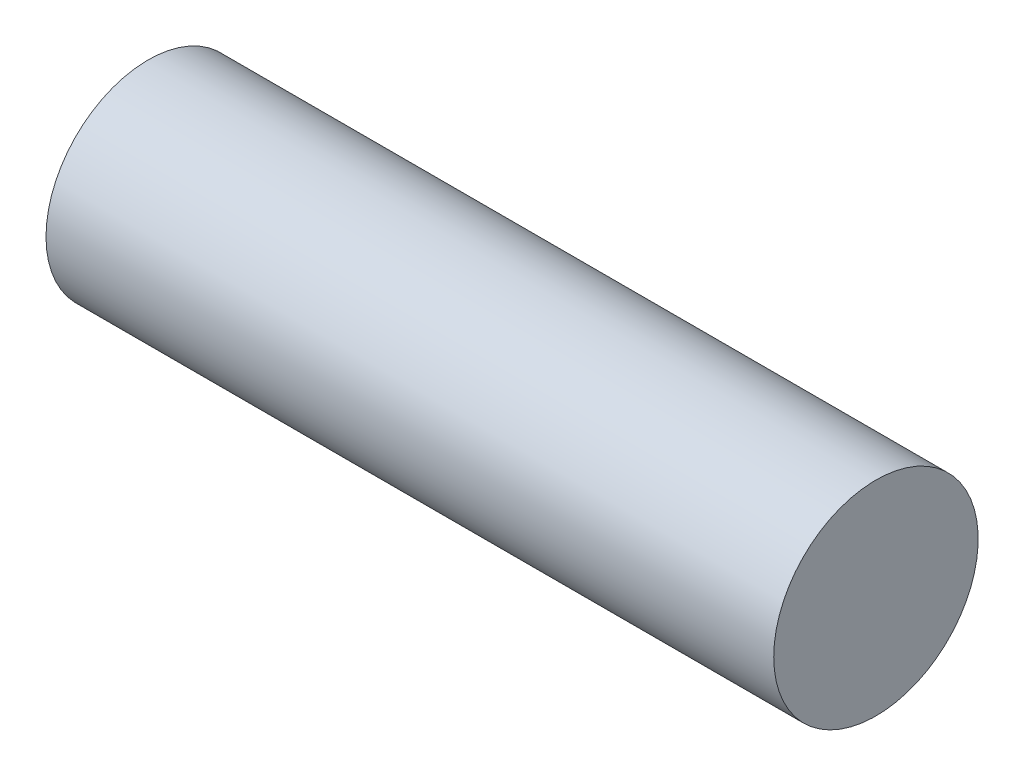
ISO-10303-21;
HEADER;
FILE_DESCRIPTION(('STEP AP214'),'2;1');
FILE_NAME('part.step','',(''),(''),'','','');
FILE_SCHEMA(('AUTOMOTIVE_DESIGN { 1 0 10303 214 1 1 1 1 }'));
ENDSEC;
DATA;
#1=APPLICATION_CONTEXT('core data for automotive mechanical design processes');
#2=APPLICATION_PROTOCOL_DEFINITION('international standard','automotive_design',2000,#1);
#3=PRODUCT_CONTEXT('',#1,'mechanical');
#4=PRODUCT('Part','Part','',(#3));
#5=PRODUCT_RELATED_PRODUCT_CATEGORY('part','',(#4));
#6=PRODUCT_DEFINITION_FORMATION('','',#4);
#7=PRODUCT_DEFINITION_CONTEXT('part definition',#1,'design');
#8=PRODUCT_DEFINITION('design','',#6,#7);
#9=PRODUCT_DEFINITION_SHAPE('','',#8);
#10=(LENGTH_UNIT() NAMED_UNIT(*) SI_UNIT(.MILLI.,.METRE.));
#11=(NAMED_UNIT(*) PLANE_ANGLE_UNIT() SI_UNIT($,.RADIAN.));
#12=(NAMED_UNIT(*) SI_UNIT($,.STERADIAN.) SOLID_ANGLE_UNIT());
#13=UNCERTAINTY_MEASURE_WITH_UNIT(LENGTH_MEASURE(1.E-05),#10,'distance_accuracy_value','');
#14=(GEOMETRIC_REPRESENTATION_CONTEXT(3) GLOBAL_UNCERTAINTY_ASSIGNED_CONTEXT((#13)) GLOBAL_UNIT_ASSIGNED_CONTEXT((#10,
#11,#12)) REPRESENTATION_CONTEXT('',''));
#15=CARTESIAN_POINT('',(0.,0.,0.));
#16=DIRECTION('',(0.,0.,1.));
#17=DIRECTION('',(1.,0.,0.));
#18=AXIS2_PLACEMENT_3D('',#15,#16,#17);
#19=CARTESIAN_POINT('',(-19.1718789343533,0.,0.));
#20=DIRECTION('',(-1.,0.,0.));
#21=DIRECTION('',(0.,0.,1.));
#22=AXIS2_PLACEMENT_3D('',#19,#20,#21);
#23=PLANE('',#22);
#24=CARTESIAN_POINT('',(-19.1718789343532,0.,0.));
#25=DIRECTION('',(-1.,0.,0.));
#26=DIRECTION('',(0.,0.,1.));
#27=AXIS2_PLACEMENT_3D('',#24,#25,#26);
#28=CIRCLE('',#27,44.271024872523);
#29=CARTESIAN_POINT('',(-19.1718789343532,0.,44.271024872523));
#30=VERTEX_POINT('',#29);
#31=EDGE_CURVE('E10',#30,#30,#28,.T.);
#32=ORIENTED_EDGE('',*,*,#31,.F.);
#33=EDGE_LOOP('',(#32));
#34=FACE_BOUND('',#33,.T.);
#35=ADVANCED_FACE('F32',(#34),#23,.F.);
#36=CARTESIAN_POINT('',(-334.361065958821,0.,0.));
#37=DIRECTION('',(-1.,0.,0.));
#38=DIRECTION('',(0.,0.,1.));
#39=AXIS2_PLACEMENT_3D('',#36,#37,#38);
#40=CYLINDRICAL_SURFACE('',#39,44.271024872523);
#41=CARTESIAN_POINT('',(-334.361065958821,0.,0.));
#42=DIRECTION('',(-1.,0.,0.));
#43=DIRECTION('',(0.,0.,1.));
#44=AXIS2_PLACEMENT_3D('',#41,#42,#43);
#45=CIRCLE('',#44,44.271024872523);
#46=CARTESIAN_POINT('',(-334.361065958821,0.,44.271024872523));
#47=VERTEX_POINT('',#46);
#48=EDGE_CURVE('E38',#47,#47,#45,.T.);
#49=ORIENTED_EDGE('',*,*,#48,.F.);
#50=EDGE_LOOP('',(#49));
#51=FACE_BOUND('',#50,.T.);
#52=ORIENTED_EDGE('',*,*,#31,.T.);
#53=EDGE_LOOP('',(#52));
#54=FACE_BOUND('',#53,.T.);
#55=ADVANCED_FACE('F46',(#51,#54),#40,.T.);
#56=CARTESIAN_POINT('',(-334.361065958821,44.271024872523,0.));
#57=DIRECTION('',(1.,0.,0.));
#58=DIRECTION('',(0.,0.,-1.));
#59=AXIS2_PLACEMENT_3D('',#56,#57,#58);
#60=PLANE('',#59);
#61=ORIENTED_EDGE('',*,*,#48,.T.);
#62=EDGE_LOOP('',(#61));
#63=FACE_BOUND('',#62,.T.);
#64=ADVANCED_FACE('F44',(#63),#60,.F.);
#65=CLOSED_SHELL('',(#35,#55,#64));
#66=MANIFOLD_SOLID_BREP('B2',#65);
#67=ADVANCED_BREP_SHAPE_REPRESENTATION('',(#18,#66),#14);
#68=SHAPE_DEFINITION_REPRESENTATION(#9,#67);
ENDSEC;
END-ISO-10303-21;
